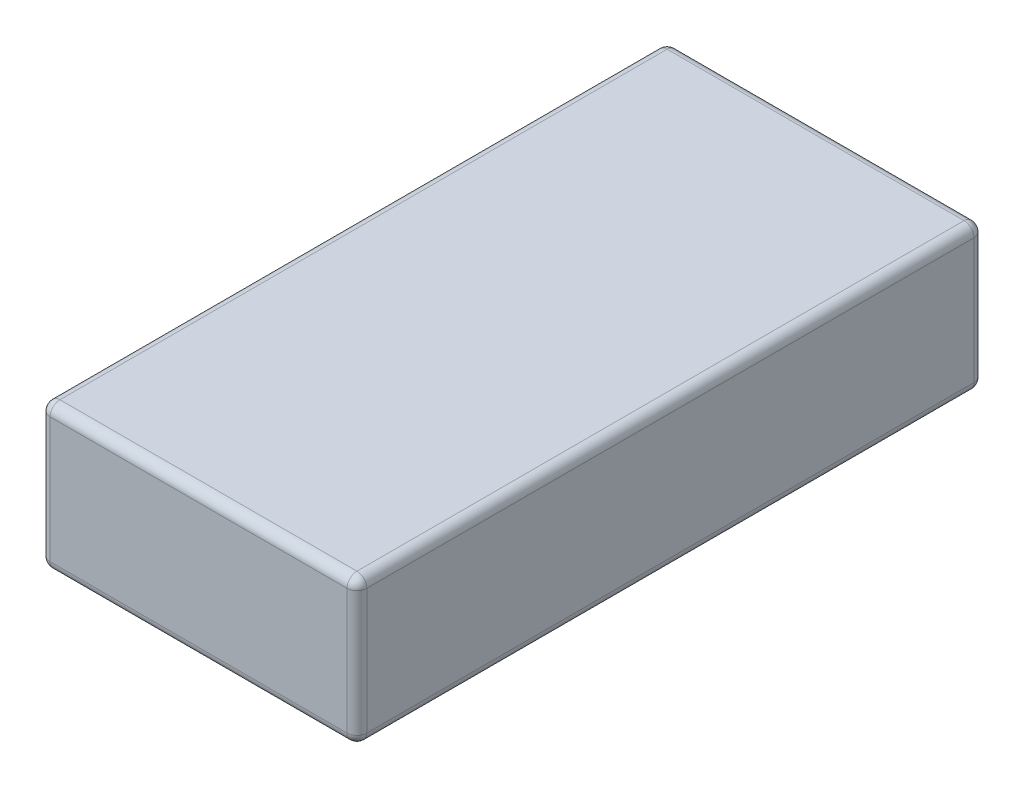
ISO-10303-21;
HEADER;
FILE_DESCRIPTION(('STEP AP214'),'2;1');
FILE_NAME('part.step','',(''),(''),'','','');
FILE_SCHEMA(('AUTOMOTIVE_DESIGN { 1 0 10303 214 1 1 1 1 }'));
ENDSEC;
DATA;
#1=APPLICATION_CONTEXT('core data for automotive mechanical design processes');
#2=APPLICATION_PROTOCOL_DEFINITION('international standard','automotive_design',2000,#1);
#3=PRODUCT_CONTEXT('',#1,'mechanical');
#4=PRODUCT('Part','Part','',(#3));
#5=PRODUCT_RELATED_PRODUCT_CATEGORY('part','',(#4));
#6=PRODUCT_DEFINITION_FORMATION('','',#4);
#7=PRODUCT_DEFINITION_CONTEXT('part definition',#1,'design');
#8=PRODUCT_DEFINITION('design','',#6,#7);
#9=PRODUCT_DEFINITION_SHAPE('','',#8);
#10=(LENGTH_UNIT() NAMED_UNIT(*) SI_UNIT(.MILLI.,.METRE.));
#11=(NAMED_UNIT(*) PLANE_ANGLE_UNIT() SI_UNIT($,.RADIAN.));
#12=(NAMED_UNIT(*) SI_UNIT($,.STERADIAN.) SOLID_ANGLE_UNIT());
#13=UNCERTAINTY_MEASURE_WITH_UNIT(LENGTH_MEASURE(1.E-05),#10,'distance_accuracy_value','');
#14=(GEOMETRIC_REPRESENTATION_CONTEXT(3) GLOBAL_UNCERTAINTY_ASSIGNED_CONTEXT((#13)) GLOBAL_UNIT_ASSIGNED_CONTEXT((#10,
#11,#12)) REPRESENTATION_CONTEXT('',''));
#15=CARTESIAN_POINT('',(0.,0.,0.));
#16=DIRECTION('',(0.,0.,1.));
#17=DIRECTION('',(1.,0.,0.));
#18=AXIS2_PLACEMENT_3D('',#15,#16,#17);
#19=CARTESIAN_POINT('',(0.,22.,-95.));
#20=DIRECTION('',(-1.,0.,0.));
#21=DIRECTION('',(0.,0.,1.));
#22=AXIS2_PLACEMENT_3D('',#19,#20,#21);
#23=PLANE('',#22);
#24=DIRECTION('',(0.,-1.,0.));
#25=VECTOR('',#24,1.);
#26=CARTESIAN_POINT('',(0.,0.,-93.5));
#27=LINE('',#26,#25);
#28=CARTESIAN_POINT('',(0.,20.5,-93.5));
#29=VERTEX_POINT('',#28);
#30=CARTESIAN_POINT('',(0.,1.5,-93.5));
#31=VERTEX_POINT('',#30);
#32=EDGE_CURVE('E136',#29,#31,#27,.T.);
#33=ORIENTED_EDGE('',*,*,#32,.T.);
#34=DIRECTION('',(0.,0.,1.));
#35=VECTOR('',#34,1.);
#36=CARTESIAN_POINT('',(0.,1.5,-95.));
#37=LINE('',#36,#35);
#38=CARTESIAN_POINT('',(0.,1.5,-1.5));
#39=VERTEX_POINT('',#38);
#40=EDGE_CURVE('E132',#31,#39,#37,.T.);
#41=ORIENTED_EDGE('',*,*,#40,.T.);
#42=DIRECTION('',(0.,-1.,0.));
#43=VECTOR('',#42,1.);
#44=CARTESIAN_POINT('',(0.,22.,-1.5));
#45=LINE('',#44,#43);
#46=CARTESIAN_POINT('',(0.,20.5,-1.5));
#47=VERTEX_POINT('',#46);
#48=EDGE_CURVE('E128',#39,#47,#45,.F.);
#49=ORIENTED_EDGE('',*,*,#48,.T.);
#50=DIRECTION('',(0.,0.,1.));
#51=VECTOR('',#50,1.);
#52=CARTESIAN_POINT('',(0.,20.5,-95.));
#53=LINE('',#52,#51);
#54=EDGE_CURVE('E130',#47,#29,#53,.F.);
#55=ORIENTED_EDGE('',*,*,#54,.T.);
#56=EDGE_LOOP('',(#33,#41,#49,#55));
#57=FACE_BOUND('',#56,.T.);
#58=ADVANCED_FACE('F36',(#57),#23,.T.);
#59=CARTESIAN_POINT('',(48.,22.,-95.));
#60=DIRECTION('',(0.,1.,0.));
#61=DIRECTION('',(-1.,0.,0.));
#62=AXIS2_PLACEMENT_3D('',#59,#60,#61);
#63=PLANE('',#62);
#64=DIRECTION('',(0.,0.,1.));
#65=VECTOR('',#64,1.);
#66=CARTESIAN_POINT('',(46.5,22.,-95.));
#67=LINE('',#66,#65);
#68=CARTESIAN_POINT('',(46.5,22.,-1.5));
#69=VERTEX_POINT('',#68);
#70=CARTESIAN_POINT('',(46.5,22.,-93.5));
#71=VERTEX_POINT('',#70);
#72=EDGE_CURVE('E239',#69,#71,#67,.F.);
#73=ORIENTED_EDGE('',*,*,#72,.T.);
#74=DIRECTION('',(-1.,0.,0.));
#75=VECTOR('',#74,1.);
#76=CARTESIAN_POINT('',(0.,22.,-93.5));
#77=LINE('',#76,#75);
#78=CARTESIAN_POINT('',(1.5,22.,-93.5));
#79=VERTEX_POINT('',#78);
#80=EDGE_CURVE('E11',#71,#79,#77,.T.);
#81=ORIENTED_EDGE('',*,*,#80,.T.);
#82=DIRECTION('',(0.,0.,1.));
#83=VECTOR('',#82,1.);
#84=CARTESIAN_POINT('',(1.5,22.,-95.));
#85=LINE('',#84,#83);
#86=CARTESIAN_POINT('',(1.5,22.,-1.5));
#87=VERTEX_POINT('',#86);
#88=EDGE_CURVE('E45',#79,#87,#85,.T.);
#89=ORIENTED_EDGE('',*,*,#88,.T.);
#90=DIRECTION('',(-1.,0.,0.));
#91=VECTOR('',#90,1.);
#92=CARTESIAN_POINT('',(48.,22.,-1.5));
#93=LINE('',#92,#91);
#94=EDGE_CURVE('E241',#87,#69,#93,.F.);
#95=ORIENTED_EDGE('',*,*,#94,.T.);
#96=EDGE_LOOP('',(#73,#81,#89,#95));
#97=FACE_BOUND('',#96,.T.);
#98=ADVANCED_FACE('F312',(#97),#63,.T.);
#99=CARTESIAN_POINT('',(48.,0.,-95.));
#100=DIRECTION('',(1.,0.,0.));
#101=DIRECTION('',(0.,1.,0.));
#102=AXIS2_PLACEMENT_3D('',#99,#100,#101);
#103=PLANE('',#102);
#104=DIRECTION('',(0.,1.,0.));
#105=VECTOR('',#104,1.);
#106=CARTESIAN_POINT('',(48.,0.,-1.5));
#107=LINE('',#106,#105);
#108=CARTESIAN_POINT('',(48.,20.5,-1.5));
#109=VERTEX_POINT('',#108);
#110=CARTESIAN_POINT('',(48.,1.5,-1.5));
#111=VERTEX_POINT('',#110);
#112=EDGE_CURVE('E234',#109,#111,#107,.F.);
#113=ORIENTED_EDGE('',*,*,#112,.T.);
#114=DIRECTION('',(0.,0.,1.));
#115=VECTOR('',#114,1.);
#116=CARTESIAN_POINT('',(48.,1.5,-95.));
#117=LINE('',#116,#115);
#118=CARTESIAN_POINT('',(48.,1.5,-93.5));
#119=VERTEX_POINT('',#118);
#120=EDGE_CURVE('E237',#111,#119,#117,.F.);
#121=ORIENTED_EDGE('',*,*,#120,.T.);
#122=DIRECTION('',(0.,1.,0.));
#123=VECTOR('',#122,1.);
#124=CARTESIAN_POINT('',(48.,22.,-93.5));
#125=LINE('',#124,#123);
#126=CARTESIAN_POINT('',(48.,20.5,-93.5));
#127=VERTEX_POINT('',#126);
#128=EDGE_CURVE('E215',#119,#127,#125,.T.);
#129=ORIENTED_EDGE('',*,*,#128,.T.);
#130=DIRECTION('',(0.,0.,1.));
#131=VECTOR('',#130,1.);
#132=CARTESIAN_POINT('',(48.,20.5,-95.));
#133=LINE('',#132,#131);
#134=EDGE_CURVE('E231',#127,#109,#133,.T.);
#135=ORIENTED_EDGE('',*,*,#134,.T.);
#136=EDGE_LOOP('',(#113,#121,#129,#135));
#137=FACE_BOUND('',#136,.T.);
#138=ADVANCED_FACE('F316',(#137),#103,.T.);
#139=CARTESIAN_POINT('',(0.,0.,-95.));
#140=DIRECTION('',(0.,-1.,0.));
#141=DIRECTION('',(0.,0.,-1.));
#142=AXIS2_PLACEMENT_3D('',#139,#140,#141);
#143=PLANE('',#142);
#144=DIRECTION('',(1.,0.,0.));
#145=VECTOR('',#144,1.);
#146=CARTESIAN_POINT('',(0.,0.,-1.5));
#147=LINE('',#146,#145);
#148=CARTESIAN_POINT('',(46.5,0.,-1.5));
#149=VERTEX_POINT('',#148);
#150=CARTESIAN_POINT('',(1.5,0.,-1.5));
#151=VERTEX_POINT('',#150);
#152=EDGE_CURVE('E270',#149,#151,#147,.F.);
#153=ORIENTED_EDGE('',*,*,#152,.T.);
#154=DIRECTION('',(0.,0.,1.));
#155=VECTOR('',#154,1.);
#156=CARTESIAN_POINT('',(1.5,0.,-95.));
#157=LINE('',#156,#155);
#158=CARTESIAN_POINT('',(1.5,0.,-93.5));
#159=VERTEX_POINT('',#158);
#160=EDGE_CURVE('E269',#151,#159,#157,.F.);
#161=ORIENTED_EDGE('',*,*,#160,.T.);
#162=DIRECTION('',(1.,0.,0.));
#163=VECTOR('',#162,1.);
#164=CARTESIAN_POINT('',(48.,0.,-93.5));
#165=LINE('',#164,#163);
#166=CARTESIAN_POINT('',(46.5,0.,-93.5));
#167=VERTEX_POINT('',#166);
#168=EDGE_CURVE('E264',#159,#167,#165,.T.);
#169=ORIENTED_EDGE('',*,*,#168,.T.);
#170=DIRECTION('',(0.,0.,1.));
#171=VECTOR('',#170,1.);
#172=CARTESIAN_POINT('',(46.5,0.,-95.));
#173=LINE('',#172,#171);
#174=EDGE_CURVE('E300',#167,#149,#173,.T.);
#175=ORIENTED_EDGE('',*,*,#174,.T.);
#176=EDGE_LOOP('',(#153,#161,#169,#175));
#177=FACE_BOUND('',#176,.T.);
#178=ADVANCED_FACE('F273',(#177),#143,.T.);
#179=CARTESIAN_POINT('',(0.,0.,-95.));
#180=DIRECTION('',(0.,0.,1.));
#181=DIRECTION('',(1.,0.,0.));
#182=AXIS2_PLACEMENT_3D('',#179,#180,#181);
#183=PLANE('',#182);
#184=DIRECTION('',(1.,0.,0.));
#185=VECTOR('',#184,1.);
#186=CARTESIAN_POINT('',(0.,1.5,-95.));
#187=LINE('',#186,#185);
#188=CARTESIAN_POINT('',(46.5,1.5,-95.));
#189=VERTEX_POINT('',#188);
#190=CARTESIAN_POINT('',(1.5,1.5,-95.));
#191=VERTEX_POINT('',#190);
#192=EDGE_CURVE('E220',#189,#191,#187,.F.);
#193=ORIENTED_EDGE('',*,*,#192,.T.);
#194=DIRECTION('',(0.,-1.,0.));
#195=VECTOR('',#194,1.);
#196=CARTESIAN_POINT('',(1.5,22.,-95.));
#197=LINE('',#196,#195);
#198=CARTESIAN_POINT('',(1.5,20.5,-95.));
#199=VERTEX_POINT('',#198);
#200=EDGE_CURVE('E223',#191,#199,#197,.F.);
#201=ORIENTED_EDGE('',*,*,#200,.T.);
#202=DIRECTION('',(-1.,0.,0.));
#203=VECTOR('',#202,1.);
#204=CARTESIAN_POINT('',(48.,20.5,-95.));
#205=LINE('',#204,#203);
#206=CARTESIAN_POINT('',(46.5,20.5,-95.));
#207=VERTEX_POINT('',#206);
#208=EDGE_CURVE('E221',#199,#207,#205,.F.);
#209=ORIENTED_EDGE('',*,*,#208,.T.);
#210=DIRECTION('',(0.,1.,0.));
#211=VECTOR('',#210,1.);
#212=CARTESIAN_POINT('',(46.5,0.,-95.));
#213=LINE('',#212,#211);
#214=EDGE_CURVE('E217',#207,#189,#213,.F.);
#215=ORIENTED_EDGE('',*,*,#214,.T.);
#216=EDGE_LOOP('',(#193,#201,#209,#215));
#217=FACE_BOUND('',#216,.T.);
#218=ADVANCED_FACE('F308',(#217),#183,.F.);
#219=CARTESIAN_POINT('',(0.,0.,0.));
#220=DIRECTION('',(0.,0.,1.));
#221=DIRECTION('',(1.,0.,0.));
#222=AXIS2_PLACEMENT_3D('',#219,#220,#221);
#223=PLANE('',#222);
#224=DIRECTION('',(0.,-1.,0.));
#225=VECTOR('',#224,1.);
#226=CARTESIAN_POINT('',(1.5,0.,0.));
#227=LINE('',#226,#225);
#228=CARTESIAN_POINT('',(1.5,20.5,0.));
#229=VERTEX_POINT('',#228);
#230=CARTESIAN_POINT('',(1.5,1.5,0.));
#231=VERTEX_POINT('',#230);
#232=EDGE_CURVE('E155',#229,#231,#227,.T.);
#233=ORIENTED_EDGE('',*,*,#232,.T.);
#234=DIRECTION('',(1.,0.,0.));
#235=VECTOR('',#234,1.);
#236=CARTESIAN_POINT('',(0.,1.5,0.));
#237=LINE('',#236,#235);
#238=CARTESIAN_POINT('',(46.5,1.5,0.));
#239=VERTEX_POINT('',#238);
#240=EDGE_CURVE('E225',#231,#239,#237,.T.);
#241=ORIENTED_EDGE('',*,*,#240,.T.);
#242=DIRECTION('',(0.,1.,0.));
#243=VECTOR('',#242,1.);
#244=CARTESIAN_POINT('',(46.5,0.,0.));
#245=LINE('',#244,#243);
#246=CARTESIAN_POINT('',(46.5,20.5,0.));
#247=VERTEX_POINT('',#246);
#248=EDGE_CURVE('E280',#239,#247,#245,.T.);
#249=ORIENTED_EDGE('',*,*,#248,.T.);
#250=DIRECTION('',(-1.,0.,0.));
#251=VECTOR('',#250,1.);
#252=CARTESIAN_POINT('',(0.,20.5,0.));
#253=LINE('',#252,#251);
#254=EDGE_CURVE('E278',#247,#229,#253,.T.);
#255=ORIENTED_EDGE('',*,*,#254,.T.);
#256=EDGE_LOOP('',(#233,#241,#249,#255));
#257=FACE_BOUND('',#256,.T.);
#258=ADVANCED_FACE('F288',(#257),#223,.T.);
#259=CARTESIAN_POINT('',(46.5,20.5,-95.));
#260=DIRECTION('',(0.,0.,1.));
#261=DIRECTION('',(1.,0.,0.));
#262=AXIS2_PLACEMENT_3D('',#259,#260,#261);
#263=CYLINDRICAL_SURFACE('',#262,1.5);
#264=CARTESIAN_POINT('',(46.5,20.5,-93.5));
#265=DIRECTION('',(0.,0.,-1.));
#266=DIRECTION('',(-1.,0.,0.));
#267=AXIS2_PLACEMENT_3D('',#264,#265,#266);
#268=CIRCLE('',#267,1.5);
#269=EDGE_CURVE('E40',#71,#127,#268,.T.);
#270=ORIENTED_EDGE('',*,*,#269,.F.);
#271=ORIENTED_EDGE('',*,*,#72,.F.);
#272=CARTESIAN_POINT('',(46.5,20.5,-1.5));
#273=DIRECTION('',(0.,0.,1.));
#274=DIRECTION('',(1.,0.,0.));
#275=AXIS2_PLACEMENT_3D('',#272,#273,#274);
#276=CIRCLE('',#275,1.5);
#277=EDGE_CURVE('E194',#109,#69,#276,.T.);
#278=ORIENTED_EDGE('',*,*,#277,.F.);
#279=ORIENTED_EDGE('',*,*,#134,.F.);
#280=EDGE_LOOP('',(#270,#271,#278,#279));
#281=FACE_BOUND('',#280,.T.);
#282=ADVANCED_FACE('F38',(#281),#263,.T.);
#283=CARTESIAN_POINT('',(46.5,20.5,-93.5));
#284=DIRECTION('',(0.,0.,1.));
#285=DIRECTION('',(1.,0.,0.));
#286=AXIS2_PLACEMENT_3D('',#283,#284,#285);
#287=SPHERICAL_SURFACE('',#286,1.5);
#288=CARTESIAN_POINT('',(46.5,20.5,-93.5));
#289=DIRECTION('',(1.,0.,0.));
#290=DIRECTION('',(0.,0.,-1.));
#291=AXIS2_PLACEMENT_3D('',#288,#289,#290);
#292=CIRCLE('',#291,1.5);
#293=EDGE_CURVE('E189',#71,#207,#292,.F.);
#294=ORIENTED_EDGE('',*,*,#293,.F.);
#295=ORIENTED_EDGE('',*,*,#269,.T.);
#296=CARTESIAN_POINT('',(46.5,20.5,-93.5));
#297=DIRECTION('',(0.,1.,0.));
#298=DIRECTION('',(0.,0.,1.));
#299=AXIS2_PLACEMENT_3D('',#296,#297,#298);
#300=CIRCLE('',#299,1.5);
#301=EDGE_CURVE('E192',#207,#127,#300,.F.);
#302=ORIENTED_EDGE('',*,*,#301,.F.);
#303=EDGE_LOOP('',(#294,#295,#302));
#304=FACE_BOUND('',#303,.T.);
#305=ADVANCED_FACE('F205',(#304),#287,.T.);
#306=CARTESIAN_POINT('',(46.5,20.5,-1.5));
#307=DIRECTION('',(0.,0.,1.));
#308=DIRECTION('',(1.,0.,0.));
#309=AXIS2_PLACEMENT_3D('',#306,#307,#308);
#310=SPHERICAL_SURFACE('',#309,1.5);
#311=CARTESIAN_POINT('',(46.5,20.5,-1.5));
#312=DIRECTION('',(0.,1.,0.));
#313=DIRECTION('',(0.,0.,1.));
#314=AXIS2_PLACEMENT_3D('',#311,#312,#313);
#315=CIRCLE('',#314,1.5);
#316=EDGE_CURVE('E183',#109,#247,#315,.F.);
#317=ORIENTED_EDGE('',*,*,#316,.F.);
#318=ORIENTED_EDGE('',*,*,#277,.T.);
#319=CARTESIAN_POINT('',(46.5,20.5,-1.5));
#320=DIRECTION('',(1.,0.,0.));
#321=DIRECTION('',(0.,0.,-1.));
#322=AXIS2_PLACEMENT_3D('',#319,#320,#321);
#323=CIRCLE('',#322,1.5);
#324=EDGE_CURVE('E186',#247,#69,#323,.F.);
#325=ORIENTED_EDGE('',*,*,#324,.F.);
#326=EDGE_LOOP('',(#317,#318,#325));
#327=FACE_BOUND('',#326,.T.);
#328=ADVANCED_FACE('F313',(#327),#310,.T.);
#329=CARTESIAN_POINT('',(46.5,0.,-93.5));
#330=DIRECTION('',(0.,-1.,0.));
#331=DIRECTION('',(1.,0.,0.));
#332=AXIS2_PLACEMENT_3D('',#329,#330,#331);
#333=CYLINDRICAL_SURFACE('',#332,1.5);
#334=ORIENTED_EDGE('',*,*,#301,.T.);
#335=ORIENTED_EDGE('',*,*,#128,.F.);
#336=CARTESIAN_POINT('',(46.5,1.5,-93.5));
#337=DIRECTION('',(0.,-1.,0.));
#338=DIRECTION('',(1.,0.,0.));
#339=AXIS2_PLACEMENT_3D('',#336,#337,#338);
#340=CIRCLE('',#339,1.5);
#341=EDGE_CURVE('E177',#189,#119,#340,.T.);
#342=ORIENTED_EDGE('',*,*,#341,.F.);
#343=ORIENTED_EDGE('',*,*,#214,.F.);
#344=EDGE_LOOP('',(#334,#335,#342,#343));
#345=FACE_BOUND('',#344,.T.);
#346=ADVANCED_FACE('F213',(#345),#333,.T.);
#347=CARTESIAN_POINT('',(48.,20.5,-93.5));
#348=DIRECTION('',(1.,0.,0.));
#349=DIRECTION('',(0.,1.,0.));
#350=AXIS2_PLACEMENT_3D('',#347,#348,#349);
#351=CYLINDRICAL_SURFACE('',#350,1.5);
#352=ORIENTED_EDGE('',*,*,#293,.T.);
#353=ORIENTED_EDGE('',*,*,#208,.F.);
#354=CARTESIAN_POINT('',(1.5,20.5,-93.5));
#355=DIRECTION('',(-1.,0.,0.));
#356=DIRECTION('',(0.,0.,1.));
#357=AXIS2_PLACEMENT_3D('',#354,#355,#356);
#358=CIRCLE('',#357,1.5);
#359=EDGE_CURVE('E175',#79,#199,#358,.T.);
#360=ORIENTED_EDGE('',*,*,#359,.F.);
#361=ORIENTED_EDGE('',*,*,#80,.F.);
#362=EDGE_LOOP('',(#352,#353,#360,#361));
#363=FACE_BOUND('',#362,.T.);
#364=ADVANCED_FACE('F311',(#363),#351,.T.);
#365=CARTESIAN_POINT('',(1.5,20.5,-95.));
#366=DIRECTION('',(0.,0.,1.));
#367=DIRECTION('',(1.,0.,0.));
#368=AXIS2_PLACEMENT_3D('',#365,#366,#367);
#369=CYLINDRICAL_SURFACE('',#368,1.5);
#370=CARTESIAN_POINT('',(1.5,20.5,-1.5));
#371=DIRECTION('',(0.,0.,1.));
#372=DIRECTION('',(1.,0.,0.));
#373=AXIS2_PLACEMENT_3D('',#370,#371,#372);
#374=CIRCLE('',#373,1.5);
#375=EDGE_CURVE('E142',#87,#47,#374,.T.);
#376=ORIENTED_EDGE('',*,*,#375,.F.);
#377=ORIENTED_EDGE('',*,*,#88,.F.);
#378=CARTESIAN_POINT('',(1.5,20.5,-93.5));
#379=DIRECTION('',(0.,0.,-1.));
#380=DIRECTION('',(-1.,0.,0.));
#381=AXIS2_PLACEMENT_3D('',#378,#379,#380);
#382=CIRCLE('',#381,1.5);
#383=EDGE_CURVE('E53',#29,#79,#382,.T.);
#384=ORIENTED_EDGE('',*,*,#383,.F.);
#385=ORIENTED_EDGE('',*,*,#54,.F.);
#386=EDGE_LOOP('',(#376,#377,#384,#385));
#387=FACE_BOUND('',#386,.T.);
#388=ADVANCED_FACE('F141',(#387),#369,.T.);
#389=CARTESIAN_POINT('',(0.,20.5,-1.5));
#390=DIRECTION('',(-1.,0.,0.));
#391=DIRECTION('',(0.,-1.,0.));
#392=AXIS2_PLACEMENT_3D('',#389,#390,#391);
#393=CYLINDRICAL_SURFACE('',#392,1.5);
#394=ORIENTED_EDGE('',*,*,#324,.T.);
#395=ORIENTED_EDGE('',*,*,#94,.F.);
#396=CARTESIAN_POINT('',(1.5,20.5,-1.5));
#397=DIRECTION('',(-1.,0.,0.));
#398=DIRECTION('',(0.,-1.,0.));
#399=AXIS2_PLACEMENT_3D('',#396,#397,#398);
#400=CIRCLE('',#399,1.5);
#401=EDGE_CURVE('E151',#229,#87,#400,.T.);
#402=ORIENTED_EDGE('',*,*,#401,.F.);
#403=ORIENTED_EDGE('',*,*,#254,.F.);
#404=EDGE_LOOP('',(#394,#395,#402,#403));
#405=FACE_BOUND('',#404,.T.);
#406=ADVANCED_FACE('F434',(#405),#393,.T.);
#407=CARTESIAN_POINT('',(46.5,0.,-1.5));
#408=DIRECTION('',(0.,1.,0.));
#409=DIRECTION('',(-1.,0.,0.));
#410=AXIS2_PLACEMENT_3D('',#407,#408,#409);
#411=CYLINDRICAL_SURFACE('',#410,1.5);
#412=ORIENTED_EDGE('',*,*,#316,.T.);
#413=ORIENTED_EDGE('',*,*,#248,.F.);
#414=CARTESIAN_POINT('',(46.5,1.5,-1.5));
#415=DIRECTION('',(0.,-1.,0.));
#416=DIRECTION('',(1.,0.,0.));
#417=AXIS2_PLACEMENT_3D('',#414,#415,#416);
#418=CIRCLE('',#417,1.5);
#419=EDGE_CURVE('E170',#111,#239,#418,.T.);
#420=ORIENTED_EDGE('',*,*,#419,.F.);
#421=ORIENTED_EDGE('',*,*,#112,.F.);
#422=EDGE_LOOP('',(#412,#413,#420,#421));
#423=FACE_BOUND('',#422,.T.);
#424=ADVANCED_FACE('F292',(#423),#411,.T.);
#425=CARTESIAN_POINT('',(46.5,1.5,-95.));
#426=DIRECTION('',(0.,0.,1.));
#427=DIRECTION('',(1.,0.,0.));
#428=AXIS2_PLACEMENT_3D('',#425,#426,#427);
#429=CYLINDRICAL_SURFACE('',#428,1.5);
#430=CARTESIAN_POINT('',(46.5,1.5,-93.5));
#431=DIRECTION('',(0.,0.,-1.));
#432=DIRECTION('',(-1.,0.,0.));
#433=AXIS2_PLACEMENT_3D('',#430,#431,#432);
#434=CIRCLE('',#433,1.5);
#435=EDGE_CURVE('E180',#119,#167,#434,.T.);
#436=ORIENTED_EDGE('',*,*,#435,.F.);
#437=ORIENTED_EDGE('',*,*,#120,.F.);
#438=CARTESIAN_POINT('',(46.5,1.5,-1.5));
#439=DIRECTION('',(0.,0.,1.));
#440=DIRECTION('',(1.,0.,0.));
#441=AXIS2_PLACEMENT_3D('',#438,#439,#440);
#442=CIRCLE('',#441,1.5);
#443=EDGE_CURVE('E168',#149,#111,#442,.T.);
#444=ORIENTED_EDGE('',*,*,#443,.F.);
#445=ORIENTED_EDGE('',*,*,#174,.F.);
#446=EDGE_LOOP('',(#436,#437,#444,#445));
#447=FACE_BOUND('',#446,.T.);
#448=ADVANCED_FACE('F318',(#447),#429,.T.);
#449=CARTESIAN_POINT('',(46.5,1.5,-93.5));
#450=DIRECTION('',(0.,0.,1.));
#451=DIRECTION('',(1.,0.,0.));
#452=AXIS2_PLACEMENT_3D('',#449,#450,#451);
#453=SPHERICAL_SURFACE('',#452,1.5);
#454=ORIENTED_EDGE('',*,*,#341,.T.);
#455=ORIENTED_EDGE('',*,*,#435,.T.);
#456=CARTESIAN_POINT('',(46.5,1.5,-93.5));
#457=DIRECTION('',(1.,0.,0.));
#458=DIRECTION('',(0.,0.,-1.));
#459=AXIS2_PLACEMENT_3D('',#456,#457,#458);
#460=CIRCLE('',#459,1.5);
#461=EDGE_CURVE('E159',#189,#167,#460,.F.);
#462=ORIENTED_EDGE('',*,*,#461,.F.);
#463=EDGE_LOOP('',(#454,#455,#462));
#464=FACE_BOUND('',#463,.T.);
#465=ADVANCED_FACE('F320',(#464),#453,.T.);
#466=CARTESIAN_POINT('',(1.5,20.5,-93.5));
#467=DIRECTION('',(0.,0.,1.));
#468=DIRECTION('',(1.,0.,0.));
#469=AXIS2_PLACEMENT_3D('',#466,#467,#468);
#470=SPHERICAL_SURFACE('',#469,1.5);
#471=ORIENTED_EDGE('',*,*,#383,.T.);
#472=ORIENTED_EDGE('',*,*,#359,.T.);
#473=CARTESIAN_POINT('',(1.5,20.5,-93.5));
#474=DIRECTION('',(0.,1.,0.));
#475=DIRECTION('',(0.,0.,1.));
#476=AXIS2_PLACEMENT_3D('',#473,#474,#475);
#477=CIRCLE('',#476,1.5);
#478=EDGE_CURVE('E156',#29,#199,#477,.F.);
#479=ORIENTED_EDGE('',*,*,#478,.F.);
#480=EDGE_LOOP('',(#471,#472,#479));
#481=FACE_BOUND('',#480,.T.);
#482=ADVANCED_FACE('F322',(#481),#470,.T.);
#483=CARTESIAN_POINT('',(1.5,20.5,-1.5));
#484=DIRECTION('',(0.,0.,1.));
#485=DIRECTION('',(1.,0.,0.));
#486=AXIS2_PLACEMENT_3D('',#483,#484,#485);
#487=SPHERICAL_SURFACE('',#486,1.5);
#488=ORIENTED_EDGE('',*,*,#401,.T.);
#489=ORIENTED_EDGE('',*,*,#375,.T.);
#490=CARTESIAN_POINT('',(1.5,20.5,-1.5));
#491=DIRECTION('',(0.,1.,0.));
#492=DIRECTION('',(0.,0.,1.));
#493=AXIS2_PLACEMENT_3D('',#490,#491,#492);
#494=CIRCLE('',#493,1.5);
#495=EDGE_CURVE('E148',#229,#47,#494,.F.);
#496=ORIENTED_EDGE('',*,*,#495,.F.);
#497=EDGE_LOOP('',(#488,#489,#496));
#498=FACE_BOUND('',#497,.T.);
#499=ADVANCED_FACE('F147',(#498),#487,.T.);
#500=CARTESIAN_POINT('',(46.5,1.5,-1.5));
#501=DIRECTION('',(0.,0.,1.));
#502=DIRECTION('',(1.,0.,0.));
#503=AXIS2_PLACEMENT_3D('',#500,#501,#502);
#504=SPHERICAL_SURFACE('',#503,1.5);
#505=ORIENTED_EDGE('',*,*,#443,.T.);
#506=ORIENTED_EDGE('',*,*,#419,.T.);
#507=CARTESIAN_POINT('',(46.5,1.5,-1.5));
#508=DIRECTION('',(1.,0.,0.));
#509=DIRECTION('',(0.,0.,-1.));
#510=AXIS2_PLACEMENT_3D('',#507,#508,#509);
#511=CIRCLE('',#510,1.5);
#512=EDGE_CURVE('E157',#149,#239,#511,.F.);
#513=ORIENTED_EDGE('',*,*,#512,.F.);
#514=EDGE_LOOP('',(#505,#506,#513));
#515=FACE_BOUND('',#514,.T.);
#516=ADVANCED_FACE('F297',(#515),#504,.T.);
#517=CARTESIAN_POINT('',(0.,1.5,-93.5));
#518=DIRECTION('',(-1.,0.,0.));
#519=DIRECTION('',(0.,0.,1.));
#520=AXIS2_PLACEMENT_3D('',#517,#518,#519);
#521=CYLINDRICAL_SURFACE('',#520,1.5);
#522=ORIENTED_EDGE('',*,*,#461,.T.);
#523=ORIENTED_EDGE('',*,*,#168,.F.);
#524=CARTESIAN_POINT('',(1.5,1.5,-93.5));
#525=DIRECTION('',(-1.,0.,0.));
#526=DIRECTION('',(0.,0.,1.));
#527=AXIS2_PLACEMENT_3D('',#524,#525,#526);
#528=CIRCLE('',#527,1.5);
#529=EDGE_CURVE('E162',#191,#159,#528,.T.);
#530=ORIENTED_EDGE('',*,*,#529,.F.);
#531=ORIENTED_EDGE('',*,*,#192,.F.);
#532=EDGE_LOOP('',(#522,#523,#530,#531));
#533=FACE_BOUND('',#532,.T.);
#534=ADVANCED_FACE('F266',(#533),#521,.T.);
#535=CARTESIAN_POINT('',(1.5,22.,-93.5));
#536=DIRECTION('',(0.,1.,0.));
#537=DIRECTION('',(0.,0.,1.));
#538=AXIS2_PLACEMENT_3D('',#535,#536,#537);
#539=CYLINDRICAL_SURFACE('',#538,1.5);
#540=ORIENTED_EDGE('',*,*,#478,.T.);
#541=ORIENTED_EDGE('',*,*,#200,.F.);
#542=CARTESIAN_POINT('',(1.5,1.5,-93.5));
#543=DIRECTION('',(0.,-1.,0.));
#544=DIRECTION('',(0.,0.,-1.));
#545=AXIS2_PLACEMENT_3D('',#542,#543,#544);
#546=CIRCLE('',#545,1.5);
#547=EDGE_CURVE('E253',#31,#191,#546,.T.);
#548=ORIENTED_EDGE('',*,*,#547,.F.);
#549=ORIENTED_EDGE('',*,*,#32,.F.);
#550=EDGE_LOOP('',(#540,#541,#548,#549));
#551=FACE_BOUND('',#550,.T.);
#552=ADVANCED_FACE('F307',(#551),#539,.T.);
#553=CARTESIAN_POINT('',(1.5,0.,-1.5));
#554=DIRECTION('',(0.,-1.,0.));
#555=DIRECTION('',(0.,0.,-1.));
#556=AXIS2_PLACEMENT_3D('',#553,#554,#555);
#557=CYLINDRICAL_SURFACE('',#556,1.5);
#558=ORIENTED_EDGE('',*,*,#495,.T.);
#559=ORIENTED_EDGE('',*,*,#48,.F.);
#560=CARTESIAN_POINT('',(1.5,1.5,-1.5));
#561=DIRECTION('',(0.,-1.,0.));
#562=DIRECTION('',(1.,0.,0.));
#563=AXIS2_PLACEMENT_3D('',#560,#561,#562);
#564=CIRCLE('',#563,1.5);
#565=EDGE_CURVE('E250',#231,#39,#564,.T.);
#566=ORIENTED_EDGE('',*,*,#565,.F.);
#567=ORIENTED_EDGE('',*,*,#232,.F.);
#568=EDGE_LOOP('',(#558,#559,#566,#567));
#569=FACE_BOUND('',#568,.T.);
#570=ADVANCED_FACE('F153',(#569),#557,.T.);
#571=CARTESIAN_POINT('',(0.,1.5,-1.5));
#572=DIRECTION('',(1.,0.,0.));
#573=DIRECTION('',(0.,0.,-1.));
#574=AXIS2_PLACEMENT_3D('',#571,#572,#573);
#575=CYLINDRICAL_SURFACE('',#574,1.5);
#576=ORIENTED_EDGE('',*,*,#512,.T.);
#577=ORIENTED_EDGE('',*,*,#240,.F.);
#578=CARTESIAN_POINT('',(1.5,1.5,-1.5));
#579=DIRECTION('',(-1.,0.,0.));
#580=DIRECTION('',(0.,0.,1.));
#581=AXIS2_PLACEMENT_3D('',#578,#579,#580);
#582=CIRCLE('',#581,1.5);
#583=EDGE_CURVE('E248',#151,#231,#582,.T.);
#584=ORIENTED_EDGE('',*,*,#583,.F.);
#585=ORIENTED_EDGE('',*,*,#152,.F.);
#586=EDGE_LOOP('',(#576,#577,#584,#585));
#587=FACE_BOUND('',#586,.T.);
#588=ADVANCED_FACE('F299',(#587),#575,.T.);
#589=CARTESIAN_POINT('',(1.5,1.5,-93.5));
#590=DIRECTION('',(0.,0.,1.));
#591=DIRECTION('',(1.,0.,0.));
#592=AXIS2_PLACEMENT_3D('',#589,#590,#591);
#593=SPHERICAL_SURFACE('',#592,1.5);
#594=ORIENTED_EDGE('',*,*,#547,.T.);
#595=ORIENTED_EDGE('',*,*,#529,.T.);
#596=CARTESIAN_POINT('',(1.5,1.5,-93.5));
#597=DIRECTION('',(0.,0.,-1.));
#598=DIRECTION('',(-1.,0.,0.));
#599=AXIS2_PLACEMENT_3D('',#596,#597,#598);
#600=CIRCLE('',#599,1.5);
#601=EDGE_CURVE('E246',#31,#159,#600,.F.);
#602=ORIENTED_EDGE('',*,*,#601,.F.);
#603=EDGE_LOOP('',(#594,#595,#602));
#604=FACE_BOUND('',#603,.T.);
#605=ADVANCED_FACE('F260',(#604),#593,.T.);
#606=CARTESIAN_POINT('',(1.5,1.5,-1.5));
#607=DIRECTION('',(0.,0.,1.));
#608=DIRECTION('',(1.,0.,0.));
#609=AXIS2_PLACEMENT_3D('',#606,#607,#608);
#610=SPHERICAL_SURFACE('',#609,1.5);
#611=ORIENTED_EDGE('',*,*,#583,.T.);
#612=ORIENTED_EDGE('',*,*,#565,.T.);
#613=CARTESIAN_POINT('',(1.5,1.5,-1.5));
#614=DIRECTION('',(0.,0.,1.));
#615=DIRECTION('',(1.,0.,0.));
#616=AXIS2_PLACEMENT_3D('',#613,#614,#615);
#617=CIRCLE('',#616,1.5);
#618=EDGE_CURVE('E244',#151,#39,#617,.F.);
#619=ORIENTED_EDGE('',*,*,#618,.F.);
#620=EDGE_LOOP('',(#611,#612,#619));
#621=FACE_BOUND('',#620,.T.);
#622=ADVANCED_FACE('F342',(#621),#610,.T.);
#623=CARTESIAN_POINT('',(1.5,1.5,-95.));
#624=DIRECTION('',(0.,0.,1.));
#625=DIRECTION('',(1.,0.,0.));
#626=AXIS2_PLACEMENT_3D('',#623,#624,#625);
#627=CYLINDRICAL_SURFACE('',#626,1.5);
#628=ORIENTED_EDGE('',*,*,#601,.T.);
#629=ORIENTED_EDGE('',*,*,#160,.F.);
#630=ORIENTED_EDGE('',*,*,#618,.T.);
#631=ORIENTED_EDGE('',*,*,#40,.F.);
#632=EDGE_LOOP('',(#628,#629,#630,#631));
#633=FACE_BOUND('',#632,.T.);
#634=ADVANCED_FACE('F339',(#633),#627,.T.);
#635=CLOSED_SHELL('',(#58,#98,#138,#178,#218,#258,#282,#305,#328,#346,#364,#388,#406,#424,#448,
#465,#482,#499,#516,#534,#552,#570,#588,#605,#622,#634));
#636=MANIFOLD_SOLID_BREP('B2',#635);
#637=ADVANCED_BREP_SHAPE_REPRESENTATION('',(#18,#636),#14);
#638=SHAPE_DEFINITION_REPRESENTATION(#9,#637);
ENDSEC;
END-ISO-10303-21;
